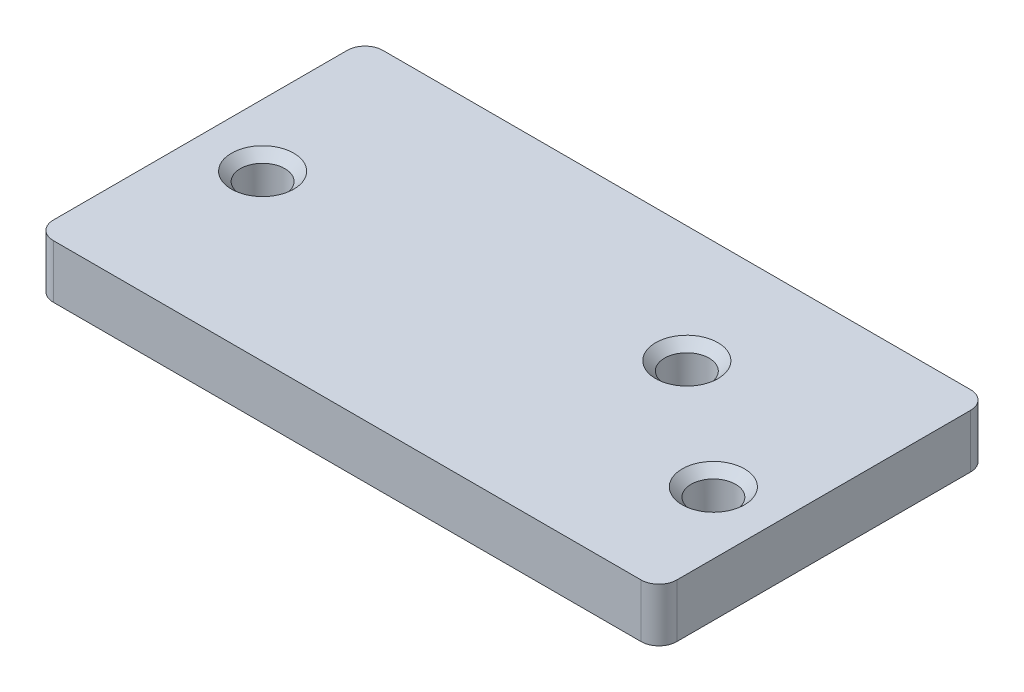
ISO-10303-21;
HEADER;
FILE_DESCRIPTION(('STEP AP214'),'2;1');
FILE_NAME('part.step','',(''),(''),'','','');
FILE_SCHEMA(('AUTOMOTIVE_DESIGN { 1 0 10303 214 1 1 1 1 }'));
ENDSEC;
DATA;
#1=APPLICATION_CONTEXT('core data for automotive mechanical design processes');
#2=APPLICATION_PROTOCOL_DEFINITION('international standard','automotive_design',2000,#1);
#3=PRODUCT_CONTEXT('',#1,'mechanical');
#4=PRODUCT('Part','Part','',(#3));
#5=PRODUCT_RELATED_PRODUCT_CATEGORY('part','',(#4));
#6=PRODUCT_DEFINITION_FORMATION('','',#4);
#7=PRODUCT_DEFINITION_CONTEXT('part definition',#1,'design');
#8=PRODUCT_DEFINITION('design','',#6,#7);
#9=PRODUCT_DEFINITION_SHAPE('','',#8);
#10=(LENGTH_UNIT() NAMED_UNIT(*) SI_UNIT(.MILLI.,.METRE.));
#11=(NAMED_UNIT(*) PLANE_ANGLE_UNIT() SI_UNIT($,.RADIAN.));
#12=(NAMED_UNIT(*) SI_UNIT($,.STERADIAN.) SOLID_ANGLE_UNIT());
#13=UNCERTAINTY_MEASURE_WITH_UNIT(LENGTH_MEASURE(1.E-05),#10,'distance_accuracy_value','');
#14=(GEOMETRIC_REPRESENTATION_CONTEXT(3) GLOBAL_UNCERTAINTY_ASSIGNED_CONTEXT((#13)) GLOBAL_UNIT_ASSIGNED_CONTEXT((#10,
#11,#12)) REPRESENTATION_CONTEXT('',''));
#15=CARTESIAN_POINT('',(0.,0.,0.));
#16=DIRECTION('',(0.,0.,1.));
#17=DIRECTION('',(1.,0.,0.));
#18=AXIS2_PLACEMENT_3D('',#15,#16,#17);
#19=CARTESIAN_POINT('',(-35.,6.,18.5));
#20=DIRECTION('',(-1.,0.,0.));
#21=DIRECTION('',(0.,0.,1.));
#22=AXIS2_PLACEMENT_3D('',#19,#20,#21);
#23=PLANE('',#22);
#24=DIRECTION('',(0.,0.,-1.));
#25=VECTOR('',#24,1.);
#26=CARTESIAN_POINT('',(-35.,6.,18.5));
#27=LINE('',#26,#25);
#28=CARTESIAN_POINT('',(-35.,6.,16.5));
#29=VERTEX_POINT('',#28);
#30=CARTESIAN_POINT('',(-35.,6.,-16.5));
#31=VERTEX_POINT('',#30);
#32=EDGE_CURVE('E280',#29,#31,#27,.T.);
#33=ORIENTED_EDGE('',*,*,#32,.T.);
#34=DIRECTION('',(0.,-1.,0.));
#35=VECTOR('',#34,1.);
#36=CARTESIAN_POINT('',(-35.,6.,-16.5));
#37=LINE('',#36,#35);
#38=CARTESIAN_POINT('',(-35.,0.,-16.5));
#39=VERTEX_POINT('',#38);
#40=EDGE_CURVE('E140',#31,#39,#37,.T.);
#41=ORIENTED_EDGE('',*,*,#40,.T.);
#42=DIRECTION('',(0.,0.,-1.));
#43=VECTOR('',#42,1.);
#44=CARTESIAN_POINT('',(-35.,0.,18.5));
#45=LINE('',#44,#43);
#46=CARTESIAN_POINT('',(-35.,0.,16.5));
#47=VERTEX_POINT('',#46);
#48=EDGE_CURVE('E123',#47,#39,#45,.T.);
#49=ORIENTED_EDGE('',*,*,#48,.F.);
#50=DIRECTION('',(0.,-1.,0.));
#51=VECTOR('',#50,1.);
#52=CARTESIAN_POINT('',(-35.,6.,16.5));
#53=LINE('',#52,#51);
#54=EDGE_CURVE('E137',#47,#29,#53,.F.);
#55=ORIENTED_EDGE('',*,*,#54,.T.);
#56=EDGE_LOOP('',(#33,#41,#49,#55));
#57=FACE_BOUND('',#56,.T.);
#58=ADVANCED_FACE('F51',(#57),#23,.T.);
#59=CARTESIAN_POINT('',(-35.,6.,18.5));
#60=DIRECTION('',(0.,0.,-1.));
#61=DIRECTION('',(-1.,0.,0.));
#62=AXIS2_PLACEMENT_3D('',#59,#60,#61);
#63=PLANE('',#62);
#64=DIRECTION('',(1.,0.,0.));
#65=VECTOR('',#64,1.);
#66=CARTESIAN_POINT('',(-35.,6.,18.5));
#67=LINE('',#66,#65);
#68=CARTESIAN_POINT('',(-33.,6.,18.5));
#69=VERTEX_POINT('',#68);
#70=CARTESIAN_POINT('',(33.,6.,18.5));
#71=VERTEX_POINT('',#70);
#72=EDGE_CURVE('E149',#69,#71,#67,.T.);
#73=ORIENTED_EDGE('',*,*,#72,.F.);
#74=DIRECTION('',(0.,-1.,0.));
#75=VECTOR('',#74,1.);
#76=CARTESIAN_POINT('',(-33.,0.,18.5));
#77=LINE('',#76,#75);
#78=CARTESIAN_POINT('',(-33.,0.,18.5));
#79=VERTEX_POINT('',#78);
#80=EDGE_CURVE('E187',#69,#79,#77,.T.);
#81=ORIENTED_EDGE('',*,*,#80,.T.);
#82=DIRECTION('',(1.,0.,0.));
#83=VECTOR('',#82,1.);
#84=CARTESIAN_POINT('',(-35.,0.,18.5));
#85=LINE('',#84,#83);
#86=CARTESIAN_POINT('',(33.,0.,18.5));
#87=VERTEX_POINT('',#86);
#88=EDGE_CURVE('E125',#79,#87,#85,.T.);
#89=ORIENTED_EDGE('',*,*,#88,.T.);
#90=DIRECTION('',(0.,-1.,0.));
#91=VECTOR('',#90,1.);
#92=CARTESIAN_POINT('',(33.,6.,18.5));
#93=LINE('',#92,#91);
#94=EDGE_CURVE('E184',#87,#71,#93,.F.);
#95=ORIENTED_EDGE('',*,*,#94,.T.);
#96=EDGE_LOOP('',(#73,#81,#89,#95));
#97=FACE_BOUND('',#96,.T.);
#98=ADVANCED_FACE('F234',(#97),#63,.F.);
#99=CARTESIAN_POINT('',(35.,6.,18.5));
#100=DIRECTION('',(-1.,0.,0.));
#101=DIRECTION('',(0.,0.,1.));
#102=AXIS2_PLACEMENT_3D('',#99,#100,#101);
#103=PLANE('',#102);
#104=DIRECTION('',(0.,0.,-1.));
#105=VECTOR('',#104,1.);
#106=CARTESIAN_POINT('',(35.,0.,18.5));
#107=LINE('',#106,#105);
#108=CARTESIAN_POINT('',(35.,0.,16.5));
#109=VERTEX_POINT('',#108);
#110=CARTESIAN_POINT('',(35.,0.,-16.5));
#111=VERTEX_POINT('',#110);
#112=EDGE_CURVE('E274',#109,#111,#107,.T.);
#113=ORIENTED_EDGE('',*,*,#112,.T.);
#114=DIRECTION('',(0.,-1.,0.));
#115=VECTOR('',#114,1.);
#116=CARTESIAN_POINT('',(35.,6.,-16.5));
#117=LINE('',#116,#115);
#118=CARTESIAN_POINT('',(35.,6.,-16.5));
#119=VERTEX_POINT('',#118);
#120=EDGE_CURVE('E68',#111,#119,#117,.F.);
#121=ORIENTED_EDGE('',*,*,#120,.T.);
#122=DIRECTION('',(0.,0.,-1.));
#123=VECTOR('',#122,1.);
#124=CARTESIAN_POINT('',(35.,6.,18.5));
#125=LINE('',#124,#123);
#126=CARTESIAN_POINT('',(35.,6.,16.5));
#127=VERTEX_POINT('',#126);
#128=EDGE_CURVE('E156',#127,#119,#125,.T.);
#129=ORIENTED_EDGE('',*,*,#128,.F.);
#130=DIRECTION('',(0.,-1.,0.));
#131=VECTOR('',#130,1.);
#132=CARTESIAN_POINT('',(35.,6.,16.5));
#133=LINE('',#132,#131);
#134=EDGE_CURVE('E190',#127,#109,#133,.T.);
#135=ORIENTED_EDGE('',*,*,#134,.T.);
#136=EDGE_LOOP('',(#113,#121,#129,#135));
#137=FACE_BOUND('',#136,.T.);
#138=ADVANCED_FACE('F239',(#137),#103,.F.);
#139=CARTESIAN_POINT('',(-35.,6.,-18.5));
#140=DIRECTION('',(0.,0.,-1.));
#141=DIRECTION('',(-1.,0.,0.));
#142=AXIS2_PLACEMENT_3D('',#139,#140,#141);
#143=PLANE('',#142);
#144=DIRECTION('',(1.,0.,0.));
#145=VECTOR('',#144,1.);
#146=CARTESIAN_POINT('',(-35.,0.,-18.5));
#147=LINE('',#146,#145);
#148=CARTESIAN_POINT('',(-33.,0.,-18.5));
#149=VERTEX_POINT('',#148);
#150=CARTESIAN_POINT('',(33.,0.,-18.5));
#151=VERTEX_POINT('',#150);
#152=EDGE_CURVE('E142',#149,#151,#147,.T.);
#153=ORIENTED_EDGE('',*,*,#152,.F.);
#154=DIRECTION('',(0.,-1.,0.));
#155=VECTOR('',#154,1.);
#156=CARTESIAN_POINT('',(-33.,6.,-18.5));
#157=LINE('',#156,#155);
#158=CARTESIAN_POINT('',(-33.,6.,-18.5));
#159=VERTEX_POINT('',#158);
#160=EDGE_CURVE('E171',#149,#159,#157,.F.);
#161=ORIENTED_EDGE('',*,*,#160,.T.);
#162=DIRECTION('',(1.,0.,0.));
#163=VECTOR('',#162,1.);
#164=CARTESIAN_POINT('',(-35.,6.,-18.5));
#165=LINE('',#164,#163);
#166=CARTESIAN_POINT('',(33.,6.,-18.5));
#167=VERTEX_POINT('',#166);
#168=EDGE_CURVE('E285',#159,#167,#165,.T.);
#169=ORIENTED_EDGE('',*,*,#168,.T.);
#170=DIRECTION('',(0.,-1.,0.));
#171=VECTOR('',#170,1.);
#172=CARTESIAN_POINT('',(33.,0.,-18.5));
#173=LINE('',#172,#171);
#174=EDGE_CURVE('E167',#167,#151,#173,.T.);
#175=ORIENTED_EDGE('',*,*,#174,.T.);
#176=EDGE_LOOP('',(#153,#161,#169,#175));
#177=FACE_BOUND('',#176,.T.);
#178=ADVANCED_FACE('F244',(#177),#143,.T.);
#179=CARTESIAN_POINT('',(0.,6.,0.));
#180=DIRECTION('',(0.,-1.,0.));
#181=DIRECTION('',(0.,0.,-1.));
#182=AXIS2_PLACEMENT_3D('',#179,#180,#181);
#183=PLANE('',#182);
#184=CARTESIAN_POINT('',(-28.,6.,0.));
#185=DIRECTION('',(0.,-1.,0.));
#186=DIRECTION('',(0.,0.,-1.));
#187=AXIS2_PLACEMENT_3D('',#184,#185,#186);
#188=CIRCLE('',#187,3.5);
#189=CARTESIAN_POINT('',(-28.,6.,-3.5));
#190=VERTEX_POINT('',#189);
#191=EDGE_CURVE('E208',#190,#190,#188,.T.);
#192=ORIENTED_EDGE('',*,*,#191,.T.);
#193=EDGE_LOOP('',(#192));
#194=FACE_BOUND('',#193,.T.);
#195=CARTESIAN_POINT('',(28.,6.,5.39));
#196=DIRECTION('',(0.,-1.,0.));
#197=DIRECTION('',(0.,0.,-1.));
#198=AXIS2_PLACEMENT_3D('',#195,#196,#197);
#199=CIRCLE('',#198,3.50000000000001);
#200=CARTESIAN_POINT('',(28.,6.,1.88999999999999));
#201=VERTEX_POINT('',#200);
#202=EDGE_CURVE('E204',#201,#201,#199,.T.);
#203=ORIENTED_EDGE('',*,*,#202,.T.);
#204=EDGE_LOOP('',(#203));
#205=FACE_BOUND('',#204,.T.);
#206=CARTESIAN_POINT('',(14.24,6.,-5.39));
#207=DIRECTION('',(0.,-1.,0.));
#208=DIRECTION('',(0.,0.,-1.));
#209=AXIS2_PLACEMENT_3D('',#206,#207,#208);
#210=CIRCLE('',#209,3.49999999999998);
#211=CARTESIAN_POINT('',(14.24,6.,-8.88999999999998));
#212=VERTEX_POINT('',#211);
#213=EDGE_CURVE('E200',#212,#212,#210,.T.);
#214=ORIENTED_EDGE('',*,*,#213,.T.);
#215=EDGE_LOOP('',(#214));
#216=FACE_BOUND('',#215,.T.);
#217=ORIENTED_EDGE('',*,*,#168,.F.);
#218=CARTESIAN_POINT('',(-33.,6.,-16.5));
#219=DIRECTION('',(0.,-1.,0.));
#220=DIRECTION('',(0.,0.,-1.));
#221=AXIS2_PLACEMENT_3D('',#218,#219,#220);
#222=CIRCLE('',#221,2.);
#223=EDGE_CURVE('E181',#159,#31,#222,.F.);
#224=ORIENTED_EDGE('',*,*,#223,.T.);
#225=ORIENTED_EDGE('',*,*,#32,.F.);
#226=CARTESIAN_POINT('',(-33.,6.,16.5));
#227=DIRECTION('',(0.,-1.,0.));
#228=DIRECTION('',(0.,0.,-1.));
#229=AXIS2_PLACEMENT_3D('',#226,#227,#228);
#230=CIRCLE('',#229,2.);
#231=EDGE_CURVE('E147',#29,#69,#230,.F.);
#232=ORIENTED_EDGE('',*,*,#231,.T.);
#233=ORIENTED_EDGE('',*,*,#72,.T.);
#234=CARTESIAN_POINT('',(33.,6.,16.5));
#235=DIRECTION('',(0.,-1.,0.));
#236=DIRECTION('',(0.,0.,-1.));
#237=AXIS2_PLACEMENT_3D('',#234,#235,#236);
#238=CIRCLE('',#237,2.);
#239=EDGE_CURVE('E75',#71,#127,#238,.F.);
#240=ORIENTED_EDGE('',*,*,#239,.T.);
#241=ORIENTED_EDGE('',*,*,#128,.T.);
#242=CARTESIAN_POINT('',(33.,6.,-16.5));
#243=DIRECTION('',(0.,-1.,0.));
#244=DIRECTION('',(0.,0.,-1.));
#245=AXIS2_PLACEMENT_3D('',#242,#243,#244);
#246=CIRCLE('',#245,2.);
#247=EDGE_CURVE('E176',#119,#167,#246,.F.);
#248=ORIENTED_EDGE('',*,*,#247,.T.);
#249=EDGE_LOOP('',(#217,#224,#225,#232,#233,#240,#241,#248));
#250=FACE_BOUND('',#249,.T.);
#251=ADVANCED_FACE('F325',(#194,#205,#216,#250),#183,.F.);
#252=CARTESIAN_POINT('',(0.,0.,0.));
#253=DIRECTION('',(0.,-1.,0.));
#254=DIRECTION('',(0.,0.,-1.));
#255=AXIS2_PLACEMENT_3D('',#252,#253,#254);
#256=PLANE('',#255);
#257=ORIENTED_EDGE('',*,*,#48,.T.);
#258=CARTESIAN_POINT('',(-33.,0.,-16.5));
#259=DIRECTION('',(0.,-1.,0.));
#260=DIRECTION('',(0.,0.,-1.));
#261=AXIS2_PLACEMENT_3D('',#258,#259,#260);
#262=CIRCLE('',#261,2.);
#263=EDGE_CURVE('E131',#39,#149,#262,.T.);
#264=ORIENTED_EDGE('',*,*,#263,.T.);
#265=ORIENTED_EDGE('',*,*,#152,.T.);
#266=CARTESIAN_POINT('',(33.,0.,-16.5));
#267=DIRECTION('',(0.,-1.,0.));
#268=DIRECTION('',(0.,0.,-1.));
#269=AXIS2_PLACEMENT_3D('',#266,#267,#268);
#270=CIRCLE('',#269,2.);
#271=EDGE_CURVE('E132',#151,#111,#270,.T.);
#272=ORIENTED_EDGE('',*,*,#271,.T.);
#273=ORIENTED_EDGE('',*,*,#112,.F.);
#274=CARTESIAN_POINT('',(33.,0.,16.5));
#275=DIRECTION('',(0.,-1.,0.));
#276=DIRECTION('',(0.,0.,-1.));
#277=AXIS2_PLACEMENT_3D('',#274,#275,#276);
#278=CIRCLE('',#277,2.);
#279=EDGE_CURVE('E154',#109,#87,#278,.T.);
#280=ORIENTED_EDGE('',*,*,#279,.T.);
#281=ORIENTED_EDGE('',*,*,#88,.F.);
#282=CARTESIAN_POINT('',(-33.,0.,16.5));
#283=DIRECTION('',(0.,-1.,0.));
#284=DIRECTION('',(0.,0.,-1.));
#285=AXIS2_PLACEMENT_3D('',#282,#283,#284);
#286=CIRCLE('',#285,2.);
#287=EDGE_CURVE('E120',#79,#47,#286,.T.);
#288=ORIENTED_EDGE('',*,*,#287,.T.);
#289=EDGE_LOOP('',(#257,#264,#265,#272,#273,#280,#281,#288));
#290=FACE_BOUND('',#289,.T.);
#291=ADVANCED_FACE('F122',(#290),#256,.T.);
#292=CARTESIAN_POINT('',(-33.,6.,-16.5));
#293=DIRECTION('',(0.,-1.,0.));
#294=DIRECTION('',(0.,0.,-1.));
#295=AXIS2_PLACEMENT_3D('',#292,#293,#294);
#296=CYLINDRICAL_SURFACE('',#295,2.);
#297=ORIENTED_EDGE('',*,*,#223,.F.);
#298=ORIENTED_EDGE('',*,*,#160,.F.);
#299=ORIENTED_EDGE('',*,*,#263,.F.);
#300=ORIENTED_EDGE('',*,*,#40,.F.);
#301=EDGE_LOOP('',(#297,#298,#299,#300));
#302=FACE_BOUND('',#301,.T.);
#303=ADVANCED_FACE('F246',(#302),#296,.T.);
#304=CARTESIAN_POINT('',(-33.,6.,16.5));
#305=DIRECTION('',(0.,1.,0.));
#306=DIRECTION('',(0.,0.,1.));
#307=AXIS2_PLACEMENT_3D('',#304,#305,#306);
#308=CYLINDRICAL_SURFACE('',#307,2.);
#309=ORIENTED_EDGE('',*,*,#231,.F.);
#310=ORIENTED_EDGE('',*,*,#54,.F.);
#311=ORIENTED_EDGE('',*,*,#287,.F.);
#312=ORIENTED_EDGE('',*,*,#80,.F.);
#313=EDGE_LOOP('',(#309,#310,#311,#312));
#314=FACE_BOUND('',#313,.T.);
#315=ADVANCED_FACE('F146',(#314),#308,.T.);
#316=CARTESIAN_POINT('',(33.,6.,-16.5));
#317=DIRECTION('',(0.,1.,0.));
#318=DIRECTION('',(0.,0.,1.));
#319=AXIS2_PLACEMENT_3D('',#316,#317,#318);
#320=CYLINDRICAL_SURFACE('',#319,2.);
#321=ORIENTED_EDGE('',*,*,#247,.F.);
#322=ORIENTED_EDGE('',*,*,#120,.F.);
#323=ORIENTED_EDGE('',*,*,#271,.F.);
#324=ORIENTED_EDGE('',*,*,#174,.F.);
#325=EDGE_LOOP('',(#321,#322,#323,#324));
#326=FACE_BOUND('',#325,.T.);
#327=ADVANCED_FACE('F252',(#326),#320,.T.);
#328=CARTESIAN_POINT('',(33.,6.,16.5));
#329=DIRECTION('',(0.,-1.,0.));
#330=DIRECTION('',(0.,0.,-1.));
#331=AXIS2_PLACEMENT_3D('',#328,#329,#330);
#332=CYLINDRICAL_SURFACE('',#331,2.);
#333=ORIENTED_EDGE('',*,*,#239,.F.);
#334=ORIENTED_EDGE('',*,*,#94,.F.);
#335=ORIENTED_EDGE('',*,*,#279,.F.);
#336=ORIENTED_EDGE('',*,*,#134,.F.);
#337=EDGE_LOOP('',(#333,#334,#335,#336));
#338=FACE_BOUND('',#337,.T.);
#339=ADVANCED_FACE('F255',(#338),#332,.T.);
#340=CARTESIAN_POINT('',(28.,0.999999999999999,5.39));
#341=DIRECTION('',(0.,1.,0.));
#342=DIRECTION('',(0.,0.,1.));
#343=AXIS2_PLACEMENT_3D('',#340,#341,#342);
#344=CYLINDRICAL_SURFACE('',#343,2.5);
#345=CARTESIAN_POINT('',(28.,4.99999999999999,5.39));
#346=DIRECTION('',(0.,-1.,0.));
#347=DIRECTION('',(0.,0.,-1.));
#348=AXIS2_PLACEMENT_3D('',#345,#346,#347);
#349=CIRCLE('',#348,2.5);
#350=CARTESIAN_POINT('',(28.,4.99999999999999,2.89));
#351=VERTEX_POINT('',#350);
#352=EDGE_CURVE('E61',#351,#351,#349,.F.);
#353=ORIENTED_EDGE('',*,*,#352,.T.);
#354=EDGE_LOOP('',(#353));
#355=FACE_BOUND('',#354,.T.);
#356=CARTESIAN_POINT('',(28.,0.999999999999999,5.39));
#357=DIRECTION('',(0.,1.,0.));
#358=DIRECTION('',(0.,0.,1.));
#359=AXIS2_PLACEMENT_3D('',#356,#357,#358);
#360=CIRCLE('',#359,2.5);
#361=CARTESIAN_POINT('',(28.,0.999999999999999,7.88999999999999));
#362=VERTEX_POINT('',#361);
#363=EDGE_CURVE('E143',#362,#362,#360,.T.);
#364=ORIENTED_EDGE('',*,*,#363,.F.);
#365=EDGE_LOOP('',(#364));
#366=FACE_BOUND('',#365,.T.);
#367=ADVANCED_FACE('F216',(#355,#366),#344,.F.);
#368=CARTESIAN_POINT('',(28.,0.999999999999999,5.39));
#369=DIRECTION('',(0.,1.,0.));
#370=DIRECTION('',(0.,0.,1.));
#371=AXIS2_PLACEMENT_3D('',#368,#369,#370);
#372=PLANE('',#371);
#373=ORIENTED_EDGE('',*,*,#363,.T.);
#374=EDGE_LOOP('',(#373));
#375=FACE_BOUND('',#374,.T.);
#376=ADVANCED_FACE('F269',(#375),#372,.T.);
#377=CARTESIAN_POINT('',(14.24,0.999999999999999,-5.39));
#378=DIRECTION('',(0.,1.,0.));
#379=DIRECTION('',(0.,0.,1.));
#380=AXIS2_PLACEMENT_3D('',#377,#378,#379);
#381=CYLINDRICAL_SURFACE('',#380,2.49999999999999);
#382=CARTESIAN_POINT('',(14.24,5.00000000000002,-5.39));
#383=DIRECTION('',(0.,-1.,0.));
#384=DIRECTION('',(0.,0.,-1.));
#385=AXIS2_PLACEMENT_3D('',#382,#383,#384);
#386=CIRCLE('',#385,2.49999999999999);
#387=CARTESIAN_POINT('',(14.24,5.00000000000002,-7.89));
#388=VERTEX_POINT('',#387);
#389=EDGE_CURVE('E11',#388,#388,#386,.F.);
#390=ORIENTED_EDGE('',*,*,#389,.T.);
#391=EDGE_LOOP('',(#390));
#392=FACE_BOUND('',#391,.T.);
#393=CARTESIAN_POINT('',(14.24,0.999999999999999,-5.39));
#394=DIRECTION('',(0.,1.,0.));
#395=DIRECTION('',(0.,0.,1.));
#396=AXIS2_PLACEMENT_3D('',#393,#394,#395);
#397=CIRCLE('',#396,2.49999999999999);
#398=CARTESIAN_POINT('',(14.24,0.999999999999999,-2.89000000000001));
#399=VERTEX_POINT('',#398);
#400=EDGE_CURVE('E294',#399,#399,#397,.T.);
#401=ORIENTED_EDGE('',*,*,#400,.F.);
#402=EDGE_LOOP('',(#401));
#403=FACE_BOUND('',#402,.T.);
#404=ADVANCED_FACE('F315',(#392,#403),#381,.F.);
#405=CARTESIAN_POINT('',(14.24,0.999999999999999,-5.39));
#406=DIRECTION('',(0.,1.,0.));
#407=DIRECTION('',(0.,0.,1.));
#408=AXIS2_PLACEMENT_3D('',#405,#406,#407);
#409=PLANE('',#408);
#410=ORIENTED_EDGE('',*,*,#400,.T.);
#411=EDGE_LOOP('',(#410));
#412=FACE_BOUND('',#411,.T.);
#413=ADVANCED_FACE('F307',(#412),#409,.T.);
#414=CARTESIAN_POINT('',(-28.,0.999999999999999,0.));
#415=DIRECTION('',(0.,1.,0.));
#416=DIRECTION('',(0.,0.,1.));
#417=AXIS2_PLACEMENT_3D('',#414,#415,#416);
#418=CYLINDRICAL_SURFACE('',#417,2.5);
#419=CARTESIAN_POINT('',(-28.,5.00000000000001,0.));
#420=DIRECTION('',(0.,-1.,0.));
#421=DIRECTION('',(0.,0.,-1.));
#422=AXIS2_PLACEMENT_3D('',#419,#420,#421);
#423=CIRCLE('',#422,2.5);
#424=CARTESIAN_POINT('',(-28.,5.00000000000001,-2.5));
#425=VERTEX_POINT('',#424);
#426=EDGE_CURVE('E196',#425,#425,#423,.F.);
#427=ORIENTED_EDGE('',*,*,#426,.T.);
#428=EDGE_LOOP('',(#427));
#429=FACE_BOUND('',#428,.T.);
#430=CARTESIAN_POINT('',(-28.,0.999999999999999,0.));
#431=DIRECTION('',(0.,1.,0.));
#432=DIRECTION('',(0.,0.,1.));
#433=AXIS2_PLACEMENT_3D('',#430,#431,#432);
#434=CIRCLE('',#433,2.5);
#435=CARTESIAN_POINT('',(-28.,0.999999999999999,2.5));
#436=VERTEX_POINT('',#435);
#437=EDGE_CURVE('E298',#436,#436,#434,.T.);
#438=ORIENTED_EDGE('',*,*,#437,.F.);
#439=EDGE_LOOP('',(#438));
#440=FACE_BOUND('',#439,.T.);
#441=ADVANCED_FACE('F305',(#429,#440),#418,.F.);
#442=CARTESIAN_POINT('',(-28.,0.999999999999999,0.));
#443=DIRECTION('',(0.,1.,0.));
#444=DIRECTION('',(0.,0.,1.));
#445=AXIS2_PLACEMENT_3D('',#442,#443,#444);
#446=PLANE('',#445);
#447=ORIENTED_EDGE('',*,*,#437,.T.);
#448=EDGE_LOOP('',(#447));
#449=FACE_BOUND('',#448,.T.);
#450=ADVANCED_FACE('F228',(#449),#446,.T.);
#451=CARTESIAN_POINT('',(-28.,5.00000000000001,0.));
#452=DIRECTION('',(0.,1.,0.));
#453=DIRECTION('',(0.,0.,1.));
#454=AXIS2_PLACEMENT_3D('',#451,#452,#453);
#455=CONICAL_SURFACE('',#454,2.5,0.785398163397451);
#456=ORIENTED_EDGE('',*,*,#191,.F.);
#457=EDGE_LOOP('',(#456));
#458=FACE_BOUND('',#457,.T.);
#459=ORIENTED_EDGE('',*,*,#426,.F.);
#460=EDGE_LOOP('',(#459));
#461=FACE_BOUND('',#460,.T.);
#462=ADVANCED_FACE('F221',(#458,#461),#455,.F.);
#463=CARTESIAN_POINT('',(28.,4.99999999999999,5.39));
#464=DIRECTION('',(0.,1.,0.));
#465=DIRECTION('',(0.,0.,1.));
#466=AXIS2_PLACEMENT_3D('',#463,#464,#465);
#467=CONICAL_SURFACE('',#466,2.5,0.785398163397448);
#468=ORIENTED_EDGE('',*,*,#202,.F.);
#469=EDGE_LOOP('',(#468));
#470=FACE_BOUND('',#469,.T.);
#471=ORIENTED_EDGE('',*,*,#352,.F.);
#472=EDGE_LOOP('',(#471));
#473=FACE_BOUND('',#472,.T.);
#474=ADVANCED_FACE('F219',(#470,#473),#467,.F.);
#475=CARTESIAN_POINT('',(14.24,5.00000000000002,-5.39));
#476=DIRECTION('',(0.,1.,0.));
#477=DIRECTION('',(0.,0.,1.));
#478=AXIS2_PLACEMENT_3D('',#475,#476,#477);
#479=CONICAL_SURFACE('',#478,2.49999999999999,0.785398163397451);
#480=ORIENTED_EDGE('',*,*,#213,.F.);
#481=EDGE_LOOP('',(#480));
#482=FACE_BOUND('',#481,.T.);
#483=ORIENTED_EDGE('',*,*,#389,.F.);
#484=EDGE_LOOP('',(#483));
#485=FACE_BOUND('',#484,.T.);
#486=ADVANCED_FACE('F54',(#482,#485),#479,.F.);
#487=CLOSED_SHELL('',(#58,#98,#138,#178,#251,#291,#303,#315,#327,#339,#367,#376,#404,#413,#441,
#450,#462,#474,#486));
#488=MANIFOLD_SOLID_BREP('B2',#487);
#489=ADVANCED_BREP_SHAPE_REPRESENTATION('',(#18,#488),#14);
#490=SHAPE_DEFINITION_REPRESENTATION(#9,#489);
ENDSEC;
END-ISO-10303-21;
